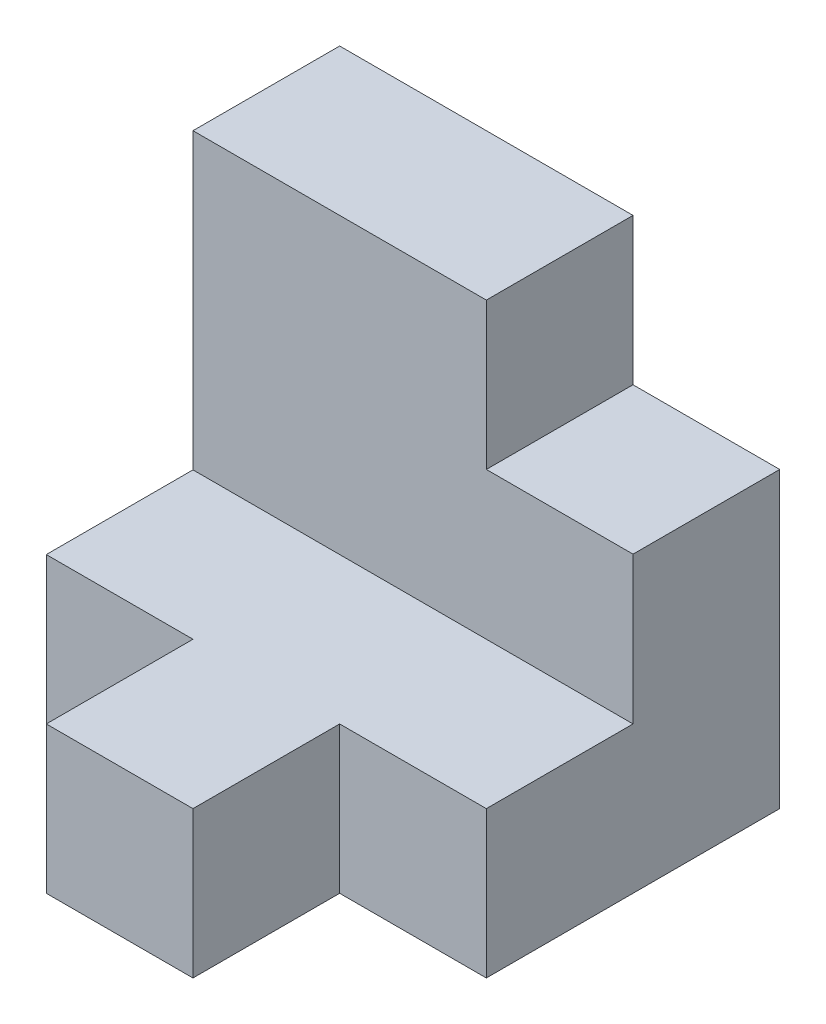
ISO-10303-21;
HEADER;
FILE_DESCRIPTION(('STEP AP214'),'2;1');
FILE_NAME('part.step','',(''),(''),'','','');
FILE_SCHEMA(('AUTOMOTIVE_DESIGN { 1 0 10303 214 1 1 1 1 }'));
ENDSEC;
DATA;
#1=APPLICATION_CONTEXT('core data for automotive mechanical design processes');
#2=APPLICATION_PROTOCOL_DEFINITION('international standard','automotive_design',2000,#1);
#3=PRODUCT_CONTEXT('',#1,'mechanical');
#4=PRODUCT('Part','Part','',(#3));
#5=PRODUCT_RELATED_PRODUCT_CATEGORY('part','',(#4));
#6=PRODUCT_DEFINITION_FORMATION('','',#4);
#7=PRODUCT_DEFINITION_CONTEXT('part definition',#1,'design');
#8=PRODUCT_DEFINITION('design','',#6,#7);
#9=PRODUCT_DEFINITION_SHAPE('','',#8);
#10=(LENGTH_UNIT() NAMED_UNIT(*) SI_UNIT(.MILLI.,.METRE.));
#11=(NAMED_UNIT(*) PLANE_ANGLE_UNIT() SI_UNIT($,.RADIAN.));
#12=(NAMED_UNIT(*) SI_UNIT($,.STERADIAN.) SOLID_ANGLE_UNIT());
#13=UNCERTAINTY_MEASURE_WITH_UNIT(LENGTH_MEASURE(1.E-05),#10,'distance_accuracy_value','');
#14=(GEOMETRIC_REPRESENTATION_CONTEXT(3) GLOBAL_UNCERTAINTY_ASSIGNED_CONTEXT((#13)) GLOBAL_UNIT_ASSIGNED_CONTEXT((#10,
#11,#12)) REPRESENTATION_CONTEXT('',''));
#15=CARTESIAN_POINT('',(0.,0.,0.));
#16=DIRECTION('',(0.,0.,1.));
#17=DIRECTION('',(1.,0.,0.));
#18=AXIS2_PLACEMENT_3D('',#15,#16,#17);
#19=CARTESIAN_POINT('',(60.,40.0494739082413,-20.));
#20=DIRECTION('',(0.,-1.,0.));
#21=DIRECTION('',(0.,0.,-1.));
#22=AXIS2_PLACEMENT_3D('',#19,#20,#21);
#23=PLANE('',#22);
#24=DIRECTION('',(0.,0.,-1.));
#25=VECTOR('',#24,1.);
#26=CARTESIAN_POINT('',(40.,40.0494739082413,-20.));
#27=LINE('',#26,#25);
#28=CARTESIAN_POINT('',(40.,40.0494739082413,0.));
#29=VERTEX_POINT('',#28);
#30=CARTESIAN_POINT('',(40.,40.0494739082413,-20.));
#31=VERTEX_POINT('',#30);
#32=EDGE_CURVE('E59',#29,#31,#27,.T.);
#33=ORIENTED_EDGE('',*,*,#32,.F.);
#34=DIRECTION('',(1.,0.,0.));
#35=VECTOR('',#34,1.);
#36=CARTESIAN_POINT('',(60.,40.0494739082413,0.));
#37=LINE('',#36,#35);
#38=CARTESIAN_POINT('',(60.,40.0494739082413,0.));
#39=VERTEX_POINT('',#38);
#40=EDGE_CURVE('E144',#29,#39,#37,.T.);
#41=ORIENTED_EDGE('',*,*,#40,.T.);
#42=DIRECTION('',(0.,0.,1.));
#43=VECTOR('',#42,1.);
#44=CARTESIAN_POINT('',(60.,40.0494739082413,-20.));
#45=LINE('',#44,#43);
#46=CARTESIAN_POINT('',(60.,40.0494739082413,-20.));
#47=VERTEX_POINT('',#46);
#48=EDGE_CURVE('E190',#47,#39,#45,.T.);
#49=ORIENTED_EDGE('',*,*,#48,.F.);
#50=DIRECTION('',(1.,0.,0.));
#51=VECTOR('',#50,1.);
#52=CARTESIAN_POINT('',(60.,40.0494739082413,-20.));
#53=LINE('',#52,#51);
#54=EDGE_CURVE('E187',#31,#47,#53,.T.);
#55=ORIENTED_EDGE('',*,*,#54,.F.);
#56=EDGE_LOOP('',(#33,#41,#49,#55));
#57=FACE_BOUND('',#56,.T.);
#58=ADVANCED_FACE('F43',(#57),#23,.F.);
#59=CARTESIAN_POINT('',(0.,0.,40.));
#60=DIRECTION('',(1.,0.,0.));
#61=DIRECTION('',(0.,0.,-1.));
#62=AXIS2_PLACEMENT_3D('',#59,#60,#61);
#63=PLANE('',#62);
#64=DIRECTION('',(0.,0.,-1.));
#65=VECTOR('',#64,1.);
#66=CARTESIAN_POINT('',(0.,0.,40.));
#67=LINE('',#66,#65);
#68=CARTESIAN_POINT('',(0.,0.,19.9999999999999));
#69=VERTEX_POINT('',#68);
#70=CARTESIAN_POINT('',(0.,0.,-20.));
#71=VERTEX_POINT('',#70);
#72=EDGE_CURVE('E259',#69,#71,#67,.T.);
#73=ORIENTED_EDGE('',*,*,#72,.F.);
#74=DIRECTION('',(0.,1.,0.));
#75=VECTOR('',#74,1.);
#76=CARTESIAN_POINT('',(0.,-20.,19.9999999999999));
#77=LINE('',#76,#75);
#78=CARTESIAN_POINT('',(0.,20.,19.9999999999999));
#79=VERTEX_POINT('',#78);
#80=EDGE_CURVE('E227',#69,#79,#77,.T.);
#81=ORIENTED_EDGE('',*,*,#80,.T.);
#82=DIRECTION('',(0.,0.,-1.));
#83=VECTOR('',#82,1.);
#84=CARTESIAN_POINT('',(0.,20.,40.));
#85=LINE('',#84,#83);
#86=CARTESIAN_POINT('',(0.,20.,0.));
#87=VERTEX_POINT('',#86);
#88=EDGE_CURVE('E140',#79,#87,#85,.T.);
#89=ORIENTED_EDGE('',*,*,#88,.T.);
#90=DIRECTION('',(0.,1.,0.));
#91=VECTOR('',#90,1.);
#92=CARTESIAN_POINT('',(0.,0.,0.));
#93=LINE('',#92,#91);
#94=CARTESIAN_POINT('',(0.,60.0494739082413,0.));
#95=VERTEX_POINT('',#94);
#96=EDGE_CURVE('E132',#87,#95,#93,.T.);
#97=ORIENTED_EDGE('',*,*,#96,.T.);
#98=DIRECTION('',(0.,0.,1.));
#99=VECTOR('',#98,1.);
#100=CARTESIAN_POINT('',(0.,60.0494739082413,-20.));
#101=LINE('',#100,#99);
#102=CARTESIAN_POINT('',(0.,60.0494739082413,-20.));
#103=VERTEX_POINT('',#102);
#104=EDGE_CURVE('E137',#103,#95,#101,.T.);
#105=ORIENTED_EDGE('',*,*,#104,.F.);
#106=DIRECTION('',(0.,1.,0.));
#107=VECTOR('',#106,1.);
#108=CARTESIAN_POINT('',(0.,0.,-20.));
#109=LINE('',#108,#107);
#110=EDGE_CURVE('E184',#71,#103,#109,.T.);
#111=ORIENTED_EDGE('',*,*,#110,.F.);
#112=EDGE_LOOP('',(#73,#81,#89,#97,#105,#111));
#113=FACE_BOUND('',#112,.T.);
#114=ADVANCED_FACE('F45',(#113),#63,.F.);
#115=CARTESIAN_POINT('',(0.,0.,40.));
#116=DIRECTION('',(0.,1.,0.));
#117=DIRECTION('',(0.,0.,1.));
#118=AXIS2_PLACEMENT_3D('',#115,#116,#117);
#119=PLANE('',#118);
#120=DIRECTION('',(-1.,0.,0.));
#121=VECTOR('',#120,1.);
#122=CARTESIAN_POINT('',(0.,0.,20.));
#123=LINE('',#122,#121);
#124=CARTESIAN_POINT('',(60.,0.,20.));
#125=VERTEX_POINT('',#124);
#126=CARTESIAN_POINT('',(40.,0.,20.));
#127=VERTEX_POINT('',#126);
#128=EDGE_CURVE('E215',#125,#127,#123,.T.);
#129=ORIENTED_EDGE('',*,*,#128,.T.);
#130=DIRECTION('',(0.,0.,1.));
#131=VECTOR('',#130,1.);
#132=CARTESIAN_POINT('',(40.,0.,40.));
#133=LINE('',#132,#131);
#134=CARTESIAN_POINT('',(40.,0.,40.));
#135=VERTEX_POINT('',#134);
#136=EDGE_CURVE('E209',#127,#135,#133,.T.);
#137=ORIENTED_EDGE('',*,*,#136,.T.);
#138=DIRECTION('',(1.,0.,0.));
#139=VECTOR('',#138,1.);
#140=CARTESIAN_POINT('',(0.,0.,40.));
#141=LINE('',#140,#139);
#142=CARTESIAN_POINT('',(20.,0.,40.));
#143=VERTEX_POINT('',#142);
#144=EDGE_CURVE('E241',#143,#135,#141,.T.);
#145=ORIENTED_EDGE('',*,*,#144,.F.);
#146=DIRECTION('',(0.,0.,-1.));
#147=VECTOR('',#146,1.);
#148=CARTESIAN_POINT('',(20.,0.,40.));
#149=LINE('',#148,#147);
#150=CARTESIAN_POINT('',(20.,0.,19.9999999999999));
#151=VERTEX_POINT('',#150);
#152=EDGE_CURVE('E230',#143,#151,#149,.T.);
#153=ORIENTED_EDGE('',*,*,#152,.T.);
#154=DIRECTION('',(-1.,0.,0.));
#155=VECTOR('',#154,1.);
#156=CARTESIAN_POINT('',(0.,0.,19.9999999999999));
#157=LINE('',#156,#155);
#158=EDGE_CURVE('E236',#151,#69,#157,.T.);
#159=ORIENTED_EDGE('',*,*,#158,.T.);
#160=ORIENTED_EDGE('',*,*,#72,.T.);
#161=DIRECTION('',(-1.,0.,0.));
#162=VECTOR('',#161,1.);
#163=CARTESIAN_POINT('',(60.,0.,-20.));
#164=LINE('',#163,#162);
#165=CARTESIAN_POINT('',(60.,0.,-20.));
#166=VERTEX_POINT('',#165);
#167=EDGE_CURVE('E180',#166,#71,#164,.T.);
#168=ORIENTED_EDGE('',*,*,#167,.F.);
#169=DIRECTION('',(0.,0.,-1.));
#170=VECTOR('',#169,1.);
#171=CARTESIAN_POINT('',(60.,0.,40.));
#172=LINE('',#171,#170);
#173=EDGE_CURVE('E256',#125,#166,#172,.T.);
#174=ORIENTED_EDGE('',*,*,#173,.F.);
#175=EDGE_LOOP('',(#129,#137,#145,#153,#159,#160,#168,#174));
#176=FACE_BOUND('',#175,.T.);
#177=ADVANCED_FACE('F271',(#176),#119,.F.);
#178=CARTESIAN_POINT('',(60.,0.,40.));
#179=DIRECTION('',(-1.,0.,0.));
#180=DIRECTION('',(0.,0.,1.));
#181=AXIS2_PLACEMENT_3D('',#178,#179,#180);
#182=PLANE('',#181);
#183=DIRECTION('',(0.,0.,-1.));
#184=VECTOR('',#183,1.);
#185=CARTESIAN_POINT('',(60.,20.,40.));
#186=LINE('',#185,#184);
#187=CARTESIAN_POINT('',(60.,20.,20.));
#188=VERTEX_POINT('',#187);
#189=CARTESIAN_POINT('',(60.,20.,0.));
#190=VERTEX_POINT('',#189);
#191=EDGE_CURVE('E252',#188,#190,#186,.T.);
#192=ORIENTED_EDGE('',*,*,#191,.F.);
#193=DIRECTION('',(0.,1.,0.));
#194=VECTOR('',#193,1.);
#195=CARTESIAN_POINT('',(60.,-20.,20.));
#196=LINE('',#195,#194);
#197=EDGE_CURVE('E205',#125,#188,#196,.T.);
#198=ORIENTED_EDGE('',*,*,#197,.F.);
#199=ORIENTED_EDGE('',*,*,#173,.T.);
#200=DIRECTION('',(0.,-1.,0.));
#201=VECTOR('',#200,1.);
#202=CARTESIAN_POINT('',(60.,0.,-20.));
#203=LINE('',#202,#201);
#204=EDGE_CURVE('E176',#47,#166,#203,.T.);
#205=ORIENTED_EDGE('',*,*,#204,.F.);
#206=ORIENTED_EDGE('',*,*,#48,.T.);
#207=DIRECTION('',(0.,-1.,0.));
#208=VECTOR('',#207,1.);
#209=CARTESIAN_POINT('',(60.,0.,0.));
#210=LINE('',#209,#208);
#211=EDGE_CURVE('E145',#39,#190,#210,.T.);
#212=ORIENTED_EDGE('',*,*,#211,.T.);
#213=EDGE_LOOP('',(#192,#198,#199,#205,#206,#212));
#214=FACE_BOUND('',#213,.T.);
#215=ADVANCED_FACE('F292',(#214),#182,.F.);
#216=CARTESIAN_POINT('',(0.,20.,40.));
#217=DIRECTION('',(0.,-1.,0.));
#218=DIRECTION('',(0.,0.,-1.));
#219=AXIS2_PLACEMENT_3D('',#216,#217,#218);
#220=PLANE('',#219);
#221=DIRECTION('',(-1.,0.,0.));
#222=VECTOR('',#221,1.);
#223=CARTESIAN_POINT('',(0.,20.,40.));
#224=LINE('',#223,#222);
#225=CARTESIAN_POINT('',(40.,20.,40.));
#226=VERTEX_POINT('',#225);
#227=CARTESIAN_POINT('',(20.,20.,40.));
#228=VERTEX_POINT('',#227);
#229=EDGE_CURVE('E245',#226,#228,#224,.T.);
#230=ORIENTED_EDGE('',*,*,#229,.F.);
#231=DIRECTION('',(0.,0.,1.));
#232=VECTOR('',#231,1.);
#233=CARTESIAN_POINT('',(40.,20.,40.));
#234=LINE('',#233,#232);
#235=CARTESIAN_POINT('',(40.,20.,20.));
#236=VERTEX_POINT('',#235);
#237=EDGE_CURVE('E67',#236,#226,#234,.T.);
#238=ORIENTED_EDGE('',*,*,#237,.F.);
#239=DIRECTION('',(-1.,0.,0.));
#240=VECTOR('',#239,1.);
#241=CARTESIAN_POINT('',(60.,20.,20.));
#242=LINE('',#241,#240);
#243=EDGE_CURVE('E199',#188,#236,#242,.T.);
#244=ORIENTED_EDGE('',*,*,#243,.F.);
#245=ORIENTED_EDGE('',*,*,#191,.T.);
#246=DIRECTION('',(-1.,0.,0.));
#247=VECTOR('',#246,1.);
#248=CARTESIAN_POINT('',(0.,20.,0.));
#249=LINE('',#248,#247);
#250=EDGE_CURVE('E240',#190,#87,#249,.T.);
#251=ORIENTED_EDGE('',*,*,#250,.T.);
#252=ORIENTED_EDGE('',*,*,#88,.F.);
#253=DIRECTION('',(-1.,0.,0.));
#254=VECTOR('',#253,1.);
#255=CARTESIAN_POINT('',(0.,20.,19.9999999999999));
#256=LINE('',#255,#254);
#257=CARTESIAN_POINT('',(20.,20.,19.9999999999999));
#258=VERTEX_POINT('',#257);
#259=EDGE_CURVE('E223',#258,#79,#256,.T.);
#260=ORIENTED_EDGE('',*,*,#259,.F.);
#261=DIRECTION('',(0.,0.,-1.));
#262=VECTOR('',#261,1.);
#263=CARTESIAN_POINT('',(20.,20.,40.));
#264=LINE('',#263,#262);
#265=EDGE_CURVE('E219',#228,#258,#264,.T.);
#266=ORIENTED_EDGE('',*,*,#265,.F.);
#267=EDGE_LOOP('',(#230,#238,#244,#245,#251,#252,#260,#266));
#268=FACE_BOUND('',#267,.T.);
#269=ADVANCED_FACE('F281',(#268),#220,.F.);
#270=CARTESIAN_POINT('',(0.,0.,40.));
#271=DIRECTION('',(0.,0.,-1.));
#272=DIRECTION('',(-1.,0.,0.));
#273=AXIS2_PLACEMENT_3D('',#270,#271,#272);
#274=PLANE('',#273);
#275=ORIENTED_EDGE('',*,*,#144,.T.);
#276=DIRECTION('',(0.,1.,0.));
#277=VECTOR('',#276,1.);
#278=CARTESIAN_POINT('',(40.,0.,40.));
#279=LINE('',#278,#277);
#280=EDGE_CURVE('E11',#135,#226,#279,.T.);
#281=ORIENTED_EDGE('',*,*,#280,.T.);
#282=ORIENTED_EDGE('',*,*,#229,.T.);
#283=DIRECTION('',(0.,-1.,0.));
#284=VECTOR('',#283,1.);
#285=CARTESIAN_POINT('',(20.,0.,40.));
#286=LINE('',#285,#284);
#287=EDGE_CURVE('E52',#228,#143,#286,.T.);
#288=ORIENTED_EDGE('',*,*,#287,.T.);
#289=EDGE_LOOP('',(#275,#281,#282,#288));
#290=FACE_BOUND('',#289,.T.);
#291=ADVANCED_FACE('F266',(#290),#274,.F.);
#292=CARTESIAN_POINT('',(0.,-20.,19.9999999999999));
#293=DIRECTION('',(0.,0.,-1.));
#294=DIRECTION('',(-1.,0.,0.));
#295=AXIS2_PLACEMENT_3D('',#292,#293,#294);
#296=PLANE('',#295);
#297=DIRECTION('',(0.,1.,0.));
#298=VECTOR('',#297,1.);
#299=CARTESIAN_POINT('',(20.,-20.,19.9999999999999));
#300=LINE('',#299,#298);
#301=EDGE_CURVE('E226',#151,#258,#300,.T.);
#302=ORIENTED_EDGE('',*,*,#301,.T.);
#303=ORIENTED_EDGE('',*,*,#259,.T.);
#304=ORIENTED_EDGE('',*,*,#80,.F.);
#305=ORIENTED_EDGE('',*,*,#158,.F.);
#306=EDGE_LOOP('',(#302,#303,#304,#305));
#307=FACE_BOUND('',#306,.T.);
#308=ADVANCED_FACE('F286',(#307),#296,.F.);
#309=CARTESIAN_POINT('',(20.,-20.,40.));
#310=DIRECTION('',(1.,0.,0.));
#311=DIRECTION('',(0.,0.,-1.));
#312=AXIS2_PLACEMENT_3D('',#309,#310,#311);
#313=PLANE('',#312);
#314=ORIENTED_EDGE('',*,*,#287,.F.);
#315=ORIENTED_EDGE('',*,*,#265,.T.);
#316=ORIENTED_EDGE('',*,*,#301,.F.);
#317=ORIENTED_EDGE('',*,*,#152,.F.);
#318=EDGE_LOOP('',(#314,#315,#316,#317));
#319=FACE_BOUND('',#318,.T.);
#320=ADVANCED_FACE('F284',(#319),#313,.F.);
#321=CARTESIAN_POINT('',(60.,-20.,20.));
#322=DIRECTION('',(0.,0.,-1.));
#323=DIRECTION('',(-1.,0.,0.));
#324=AXIS2_PLACEMENT_3D('',#321,#322,#323);
#325=PLANE('',#324);
#326=ORIENTED_EDGE('',*,*,#197,.T.);
#327=ORIENTED_EDGE('',*,*,#243,.T.);
#328=DIRECTION('',(0.,1.,0.));
#329=VECTOR('',#328,1.);
#330=CARTESIAN_POINT('',(40.,-20.,20.));
#331=LINE('',#330,#329);
#332=EDGE_CURVE('E206',#127,#236,#331,.T.);
#333=ORIENTED_EDGE('',*,*,#332,.F.);
#334=ORIENTED_EDGE('',*,*,#128,.F.);
#335=EDGE_LOOP('',(#326,#327,#333,#334));
#336=FACE_BOUND('',#335,.T.);
#337=ADVANCED_FACE('F276',(#336),#325,.F.);
#338=CARTESIAN_POINT('',(40.,-20.,40.));
#339=DIRECTION('',(-1.,0.,0.));
#340=DIRECTION('',(0.,0.,1.));
#341=AXIS2_PLACEMENT_3D('',#338,#339,#340);
#342=PLANE('',#341);
#343=ORIENTED_EDGE('',*,*,#332,.T.);
#344=ORIENTED_EDGE('',*,*,#237,.T.);
#345=ORIENTED_EDGE('',*,*,#280,.F.);
#346=ORIENTED_EDGE('',*,*,#136,.F.);
#347=EDGE_LOOP('',(#343,#344,#345,#346));
#348=FACE_BOUND('',#347,.T.);
#349=ADVANCED_FACE('F274',(#348),#342,.F.);
#350=CARTESIAN_POINT('',(0.,0.,0.));
#351=DIRECTION('',(0.,0.,1.));
#352=DIRECTION('',(1.,0.,0.));
#353=AXIS2_PLACEMENT_3D('',#350,#351,#352);
#354=PLANE('',#353);
#355=ORIENTED_EDGE('',*,*,#250,.F.);
#356=ORIENTED_EDGE('',*,*,#211,.F.);
#357=ORIENTED_EDGE('',*,*,#40,.F.);
#358=DIRECTION('',(0.,-1.,0.));
#359=VECTOR('',#358,1.);
#360=CARTESIAN_POINT('',(40.,60.0494739082413,0.));
#361=LINE('',#360,#359);
#362=CARTESIAN_POINT('',(40.,60.0494739082413,0.));
#363=VERTEX_POINT('',#362);
#364=EDGE_CURVE('E151',#363,#29,#361,.T.);
#365=ORIENTED_EDGE('',*,*,#364,.F.);
#366=DIRECTION('',(1.,0.,0.));
#367=VECTOR('',#366,1.);
#368=CARTESIAN_POINT('',(0.,60.0494739082413,0.));
#369=LINE('',#368,#367);
#370=EDGE_CURVE('E148',#95,#363,#369,.T.);
#371=ORIENTED_EDGE('',*,*,#370,.F.);
#372=ORIENTED_EDGE('',*,*,#96,.F.);
#373=EDGE_LOOP('',(#355,#356,#357,#365,#371,#372));
#374=FACE_BOUND('',#373,.T.);
#375=ADVANCED_FACE('F149',(#374),#354,.T.);
#376=CARTESIAN_POINT('',(0.,0.,-20.));
#377=DIRECTION('',(0.,0.,1.));
#378=DIRECTION('',(1.,0.,0.));
#379=AXIS2_PLACEMENT_3D('',#376,#377,#378);
#380=PLANE('',#379);
#381=ORIENTED_EDGE('',*,*,#204,.T.);
#382=ORIENTED_EDGE('',*,*,#167,.T.);
#383=ORIENTED_EDGE('',*,*,#110,.T.);
#384=DIRECTION('',(-1.,0.,0.));
#385=VECTOR('',#384,1.);
#386=CARTESIAN_POINT('',(0.,60.0494739082413,-20.));
#387=LINE('',#386,#385);
#388=CARTESIAN_POINT('',(40.,60.0494739082413,-20.));
#389=VERTEX_POINT('',#388);
#390=EDGE_CURVE('E160',#389,#103,#387,.T.);
#391=ORIENTED_EDGE('',*,*,#390,.F.);
#392=DIRECTION('',(0.,-1.,0.));
#393=VECTOR('',#392,1.);
#394=CARTESIAN_POINT('',(40.,60.0494739082413,-20.));
#395=LINE('',#394,#393);
#396=EDGE_CURVE('E169',#389,#31,#395,.T.);
#397=ORIENTED_EDGE('',*,*,#396,.T.);
#398=ORIENTED_EDGE('',*,*,#54,.T.);
#399=EDGE_LOOP('',(#381,#382,#383,#391,#397,#398));
#400=FACE_BOUND('',#399,.T.);
#401=ADVANCED_FACE('F289',(#400),#380,.F.);
#402=CARTESIAN_POINT('',(40.,60.0494739082413,-20.));
#403=DIRECTION('',(-1.,0.,0.));
#404=DIRECTION('',(0.,0.,1.));
#405=AXIS2_PLACEMENT_3D('',#402,#403,#404);
#406=PLANE('',#405);
#407=ORIENTED_EDGE('',*,*,#32,.T.);
#408=ORIENTED_EDGE('',*,*,#396,.F.);
#409=DIRECTION('',(0.,0.,-1.));
#410=VECTOR('',#409,1.);
#411=CARTESIAN_POINT('',(40.,60.0494739082413,-20.));
#412=LINE('',#411,#410);
#413=EDGE_CURVE('E155',#363,#389,#412,.T.);
#414=ORIENTED_EDGE('',*,*,#413,.F.);
#415=ORIENTED_EDGE('',*,*,#364,.T.);
#416=EDGE_LOOP('',(#407,#408,#414,#415));
#417=FACE_BOUND('',#416,.T.);
#418=ADVANCED_FACE('F296',(#417),#406,.F.);
#419=CARTESIAN_POINT('',(0.,60.0494739082413,0.));
#420=DIRECTION('',(0.,1.,0.));
#421=DIRECTION('',(0.,0.,1.));
#422=AXIS2_PLACEMENT_3D('',#419,#420,#421);
#423=PLANE('',#422);
#424=ORIENTED_EDGE('',*,*,#104,.T.);
#425=ORIENTED_EDGE('',*,*,#370,.T.);
#426=ORIENTED_EDGE('',*,*,#413,.T.);
#427=ORIENTED_EDGE('',*,*,#390,.T.);
#428=EDGE_LOOP('',(#424,#425,#426,#427));
#429=FACE_BOUND('',#428,.T.);
#430=ADVANCED_FACE('F158',(#429),#423,.T.);
#431=CLOSED_SHELL('',(#58,#114,#177,#215,#269,#291,#308,#320,#337,#349,#375,#401,#418,#430));
#432=MANIFOLD_SOLID_BREP('B2',#431);
#433=ADVANCED_BREP_SHAPE_REPRESENTATION('',(#18,#432),#14);
#434=SHAPE_DEFINITION_REPRESENTATION(#9,#433);
ENDSEC;
END-ISO-10303-21;
